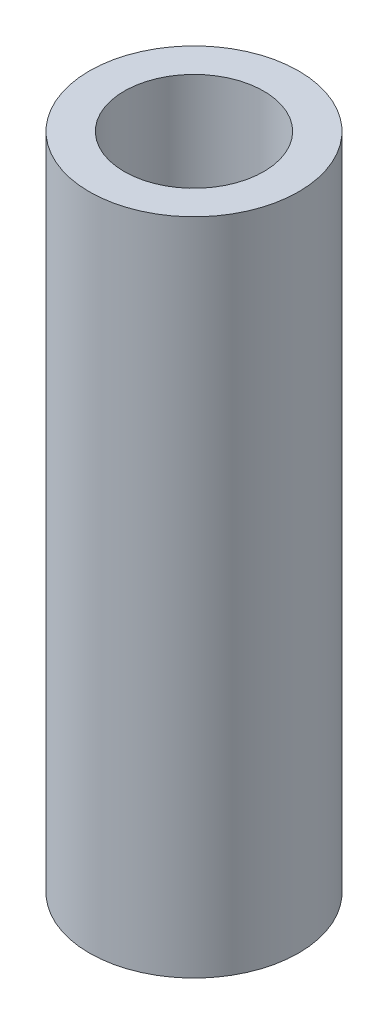
ISO-10303-21;
HEADER;
FILE_DESCRIPTION(('STEP AP214'),'2;1');
FILE_NAME('part.step','',(''),(''),'','','');
FILE_SCHEMA(('AUTOMOTIVE_DESIGN { 1 0 10303 214 1 1 1 1 }'));
ENDSEC;
DATA;
#1=APPLICATION_CONTEXT('core data for automotive mechanical design processes');
#2=APPLICATION_PROTOCOL_DEFINITION('international standard','automotive_design',2000,#1);
#3=PRODUCT_CONTEXT('',#1,'mechanical');
#4=PRODUCT('Part','Part','',(#3));
#5=PRODUCT_RELATED_PRODUCT_CATEGORY('part','',(#4));
#6=PRODUCT_DEFINITION_FORMATION('','',#4);
#7=PRODUCT_DEFINITION_CONTEXT('part definition',#1,'design');
#8=PRODUCT_DEFINITION('design','',#6,#7);
#9=PRODUCT_DEFINITION_SHAPE('','',#8);
#10=(LENGTH_UNIT() NAMED_UNIT(*) SI_UNIT(.MILLI.,.METRE.));
#11=(NAMED_UNIT(*) PLANE_ANGLE_UNIT() SI_UNIT($,.RADIAN.));
#12=(NAMED_UNIT(*) SI_UNIT($,.STERADIAN.) SOLID_ANGLE_UNIT());
#13=UNCERTAINTY_MEASURE_WITH_UNIT(LENGTH_MEASURE(1.E-05),#10,'distance_accuracy_value','');
#14=(GEOMETRIC_REPRESENTATION_CONTEXT(3) GLOBAL_UNCERTAINTY_ASSIGNED_CONTEXT((#13)) GLOBAL_UNIT_ASSIGNED_CONTEXT((#10,
#11,#12)) REPRESENTATION_CONTEXT('',''));
#15=CARTESIAN_POINT('',(0.,0.,0.));
#16=DIRECTION('',(0.,0.,1.));
#17=DIRECTION('',(1.,0.,0.));
#18=AXIS2_PLACEMENT_3D('',#15,#16,#17);
#19=CARTESIAN_POINT('',(0.,30.,0.));
#20=DIRECTION('',(0.,1.,0.));
#21=DIRECTION('',(0.,0.,1.));
#22=AXIS2_PLACEMENT_3D('',#19,#20,#21);
#23=PLANE('',#22);
#24=CARTESIAN_POINT('',(0.,30.,0.));
#25=DIRECTION('',(0.,1.,0.));
#26=DIRECTION('',(0.,0.,1.));
#27=AXIS2_PLACEMENT_3D('',#24,#25,#26);
#28=CIRCLE('',#27,4.7625);
#29=CARTESIAN_POINT('',(0.,30.,4.7625));
#30=VERTEX_POINT('',#29);
#31=EDGE_CURVE('E10',#30,#30,#28,.T.);
#32=ORIENTED_EDGE('',*,*,#31,.T.);
#33=EDGE_LOOP('',(#32));
#34=FACE_BOUND('',#33,.T.);
#35=CARTESIAN_POINT('',(0.,30.,0.));
#36=DIRECTION('',(0.,1.,0.));
#37=DIRECTION('',(0.,0.,1.));
#38=AXIS2_PLACEMENT_3D('',#35,#36,#37);
#39=CIRCLE('',#38,3.175);
#40=CARTESIAN_POINT('',(0.,30.,3.175));
#41=VERTEX_POINT('',#40);
#42=EDGE_CURVE('E54',#41,#41,#39,.T.);
#43=ORIENTED_EDGE('',*,*,#42,.F.);
#44=EDGE_LOOP('',(#43));
#45=FACE_BOUND('',#44,.T.);
#46=ADVANCED_FACE('F41',(#34,#45),#23,.T.);
#47=CARTESIAN_POINT('',(0.,0.,0.));
#48=DIRECTION('',(0.,1.,0.));
#49=DIRECTION('',(0.,0.,1.));
#50=AXIS2_PLACEMENT_3D('',#47,#48,#49);
#51=PLANE('',#50);
#52=CARTESIAN_POINT('',(0.,0.,0.));
#53=DIRECTION('',(0.,1.,0.));
#54=DIRECTION('',(0.,0.,1.));
#55=AXIS2_PLACEMENT_3D('',#52,#53,#54);
#56=CIRCLE('',#55,4.7625);
#57=CARTESIAN_POINT('',(0.,0.,4.7625));
#58=VERTEX_POINT('',#57);
#59=EDGE_CURVE('E45',#58,#58,#56,.T.);
#60=ORIENTED_EDGE('',*,*,#59,.F.);
#61=EDGE_LOOP('',(#60));
#62=FACE_BOUND('',#61,.T.);
#63=CARTESIAN_POINT('',(0.,0.,0.));
#64=DIRECTION('',(0.,1.,0.));
#65=DIRECTION('',(0.,0.,1.));
#66=AXIS2_PLACEMENT_3D('',#63,#64,#65);
#67=CIRCLE('',#66,3.175);
#68=CARTESIAN_POINT('',(0.,0.,3.175));
#69=VERTEX_POINT('',#68);
#70=EDGE_CURVE('E56',#69,#69,#67,.T.);
#71=ORIENTED_EDGE('',*,*,#70,.T.);
#72=EDGE_LOOP('',(#71));
#73=FACE_BOUND('',#72,.T.);
#74=ADVANCED_FACE('F68',(#62,#73),#51,.F.);
#75=CARTESIAN_POINT('',(0.,30.,0.));
#76=DIRECTION('',(0.,-1.,0.));
#77=DIRECTION('',(0.,0.,-1.));
#78=AXIS2_PLACEMENT_3D('',#75,#76,#77);
#79=CYLINDRICAL_SURFACE('',#78,4.7625);
#80=ORIENTED_EDGE('',*,*,#31,.F.);
#81=EDGE_LOOP('',(#80));
#82=FACE_BOUND('',#81,.T.);
#83=ORIENTED_EDGE('',*,*,#59,.T.);
#84=EDGE_LOOP('',(#83));
#85=FACE_BOUND('',#84,.T.);
#86=ADVANCED_FACE('F43',(#82,#85),#79,.T.);
#87=CARTESIAN_POINT('',(0.,30.,0.));
#88=DIRECTION('',(0.,-1.,0.));
#89=DIRECTION('',(0.,0.,-1.));
#90=AXIS2_PLACEMENT_3D('',#87,#88,#89);
#91=CYLINDRICAL_SURFACE('',#90,3.175);
#92=ORIENTED_EDGE('',*,*,#42,.T.);
#93=EDGE_LOOP('',(#92));
#94=FACE_BOUND('',#93,.T.);
#95=ORIENTED_EDGE('',*,*,#70,.F.);
#96=EDGE_LOOP('',(#95));
#97=FACE_BOUND('',#96,.T.);
#98=ADVANCED_FACE('F64',(#94,#97),#91,.F.);
#99=CLOSED_SHELL('',(#46,#74,#86,#98));
#100=MANIFOLD_SOLID_BREP('B2',#99);
#101=ADVANCED_BREP_SHAPE_REPRESENTATION('',(#18,#100),#14);
#102=SHAPE_DEFINITION_REPRESENTATION(#9,#101);
ENDSEC;
END-ISO-10303-21;
